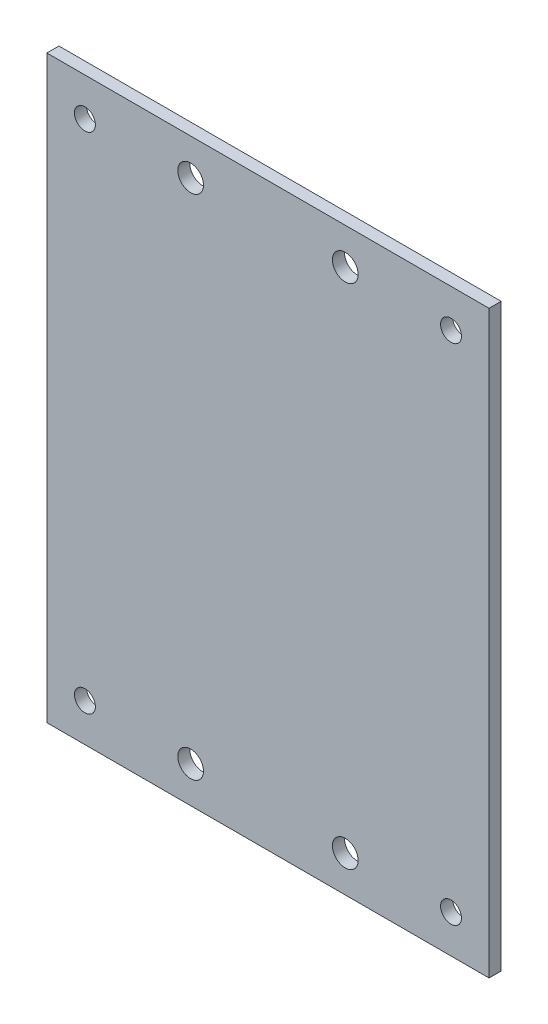
ISO-10303-21;
HEADER;
FILE_DESCRIPTION(('STEP AP214'),'2;1');
FILE_NAME('part.step','',(''),(''),'','','');
FILE_SCHEMA(('AUTOMOTIVE_DESIGN { 1 0 10303 214 1 1 1 1 }'));
ENDSEC;
DATA;
#1=APPLICATION_CONTEXT('core data for automotive mechanical design processes');
#2=APPLICATION_PROTOCOL_DEFINITION('international standard','automotive_design',2000,#1);
#3=PRODUCT_CONTEXT('',#1,'mechanical');
#4=PRODUCT('Part','Part','',(#3));
#5=PRODUCT_RELATED_PRODUCT_CATEGORY('part','',(#4));
#6=PRODUCT_DEFINITION_FORMATION('','',#4);
#7=PRODUCT_DEFINITION_CONTEXT('part definition',#1,'design');
#8=PRODUCT_DEFINITION('design','',#6,#7);
#9=PRODUCT_DEFINITION_SHAPE('','',#8);
#10=(LENGTH_UNIT() NAMED_UNIT(*) SI_UNIT(.MILLI.,.METRE.));
#11=(NAMED_UNIT(*) PLANE_ANGLE_UNIT() SI_UNIT($,.RADIAN.));
#12=(NAMED_UNIT(*) SI_UNIT($,.STERADIAN.) SOLID_ANGLE_UNIT());
#13=UNCERTAINTY_MEASURE_WITH_UNIT(LENGTH_MEASURE(1.E-05),#10,'distance_accuracy_value','');
#14=(GEOMETRIC_REPRESENTATION_CONTEXT(3) GLOBAL_UNCERTAINTY_ASSIGNED_CONTEXT((#13)) GLOBAL_UNIT_ASSIGNED_CONTEXT((#10,
#11,#12)) REPRESENTATION_CONTEXT('',''));
#15=CARTESIAN_POINT('',(0.,0.,0.));
#16=DIRECTION('',(0.,0.,1.));
#17=DIRECTION('',(1.,0.,0.));
#18=AXIS2_PLACEMENT_3D('',#15,#16,#17);
#19=CARTESIAN_POINT('',(0.,0.,3.175));
#20=DIRECTION('',(0.,0.,-1.));
#21=DIRECTION('',(-1.,0.,0.));
#22=AXIS2_PLACEMENT_3D('',#19,#20,#21);
#23=PLANE('',#22);
#24=CARTESIAN_POINT('',(78.42,142.875,3.175));
#25=DIRECTION('',(0.,0.,-1.));
#26=DIRECTION('',(-1.,0.,0.));
#27=AXIS2_PLACEMENT_3D('',#24,#25,#26);
#28=CIRCLE('',#27,3.37819999999999);
#29=CARTESIAN_POINT('',(75.0418,142.875,3.175));
#30=VERTEX_POINT('',#29);
#31=EDGE_CURVE('E158',#30,#30,#28,.T.);
#32=ORIENTED_EDGE('',*,*,#31,.T.);
#33=EDGE_LOOP('',(#32));
#34=FACE_BOUND('',#33,.T.);
#35=CARTESIAN_POINT('',(37.78,142.875,3.175));
#36=DIRECTION('',(0.,0.,-1.));
#37=DIRECTION('',(-1.,0.,0.));
#38=AXIS2_PLACEMENT_3D('',#35,#36,#37);
#39=CIRCLE('',#38,3.37819999999999);
#40=CARTESIAN_POINT('',(34.4018,142.875,3.175));
#41=VERTEX_POINT('',#40);
#42=EDGE_CURVE('E152',#41,#41,#39,.T.);
#43=ORIENTED_EDGE('',*,*,#42,.T.);
#44=EDGE_LOOP('',(#43));
#45=FACE_BOUND('',#44,.T.);
#46=CARTESIAN_POINT('',(37.78,9.525,3.175));
#47=DIRECTION('',(0.,0.,-1.));
#48=DIRECTION('',(-1.,0.,0.));
#49=AXIS2_PLACEMENT_3D('',#46,#47,#48);
#50=CIRCLE('',#49,3.37819999999999);
#51=CARTESIAN_POINT('',(34.4018,9.525,3.175));
#52=VERTEX_POINT('',#51);
#53=EDGE_CURVE('E146',#52,#52,#50,.T.);
#54=ORIENTED_EDGE('',*,*,#53,.T.);
#55=EDGE_LOOP('',(#54));
#56=FACE_BOUND('',#55,.T.);
#57=CARTESIAN_POINT('',(78.42,9.525,3.175));
#58=DIRECTION('',(0.,0.,-1.));
#59=DIRECTION('',(-1.,0.,0.));
#60=AXIS2_PLACEMENT_3D('',#57,#58,#59);
#61=CIRCLE('',#60,3.37819999999999);
#62=CARTESIAN_POINT('',(75.0418,9.525,3.175));
#63=VERTEX_POINT('',#62);
#64=EDGE_CURVE('E140',#63,#63,#61,.T.);
#65=ORIENTED_EDGE('',*,*,#64,.T.);
#66=EDGE_LOOP('',(#65));
#67=FACE_BOUND('',#66,.T.);
#68=CARTESIAN_POINT('',(10.,142.4,3.175));
#69=DIRECTION('',(0.,0.,1.));
#70=DIRECTION('',(1.,0.,0.));
#71=AXIS2_PLACEMENT_3D('',#68,#69,#70);
#72=CIRCLE('',#71,2.75);
#73=CARTESIAN_POINT('',(12.75,142.4,3.175));
#74=VERTEX_POINT('',#73);
#75=EDGE_CURVE('E137',#74,#74,#72,.T.);
#76=ORIENTED_EDGE('',*,*,#75,.F.);
#77=EDGE_LOOP('',(#76));
#78=FACE_BOUND('',#77,.T.);
#79=CARTESIAN_POINT('',(106.2,10.,3.175));
#80=DIRECTION('',(0.,0.,1.));
#81=DIRECTION('',(1.,0.,0.));
#82=AXIS2_PLACEMENT_3D('',#79,#80,#81);
#83=CIRCLE('',#82,2.75);
#84=CARTESIAN_POINT('',(108.95,10.,3.175));
#85=VERTEX_POINT('',#84);
#86=EDGE_CURVE('E125',#85,#85,#83,.T.);
#87=ORIENTED_EDGE('',*,*,#86,.F.);
#88=EDGE_LOOP('',(#87));
#89=FACE_BOUND('',#88,.T.);
#90=CARTESIAN_POINT('',(10.,9.99999999999998,3.175));
#91=DIRECTION('',(0.,0.,1.));
#92=DIRECTION('',(1.,0.,0.));
#93=AXIS2_PLACEMENT_3D('',#90,#91,#92);
#94=CIRCLE('',#93,2.75);
#95=CARTESIAN_POINT('',(12.75,9.99999999999998,3.175));
#96=VERTEX_POINT('',#95);
#97=EDGE_CURVE('E119',#96,#96,#94,.T.);
#98=ORIENTED_EDGE('',*,*,#97,.F.);
#99=EDGE_LOOP('',(#98));
#100=FACE_BOUND('',#99,.T.);
#101=DIRECTION('',(0.,-1.,0.));
#102=VECTOR('',#101,1.);
#103=CARTESIAN_POINT('',(0.,0.,3.175));
#104=LINE('',#103,#102);
#105=CARTESIAN_POINT('',(0.,152.4,3.175));
#106=VERTEX_POINT('',#105);
#107=CARTESIAN_POINT('',(0.,0.,3.175));
#108=VERTEX_POINT('',#107);
#109=EDGE_CURVE('E91',#106,#108,#104,.T.);
#110=ORIENTED_EDGE('',*,*,#109,.T.);
#111=DIRECTION('',(1.,0.,0.));
#112=VECTOR('',#111,1.);
#113=CARTESIAN_POINT('',(0.,0.,3.175));
#114=LINE('',#113,#112);
#115=CARTESIAN_POINT('',(116.2,0.,3.175));
#116=VERTEX_POINT('',#115);
#117=EDGE_CURVE('E86',#108,#116,#114,.T.);
#118=ORIENTED_EDGE('',*,*,#117,.T.);
#119=DIRECTION('',(0.,1.,0.));
#120=VECTOR('',#119,1.);
#121=CARTESIAN_POINT('',(116.2,0.,3.175));
#122=LINE('',#121,#120);
#123=CARTESIAN_POINT('',(116.2,152.4,3.175));
#124=VERTEX_POINT('',#123);
#125=EDGE_CURVE('E89',#116,#124,#122,.T.);
#126=ORIENTED_EDGE('',*,*,#125,.T.);
#127=DIRECTION('',(-1.,0.,0.));
#128=VECTOR('',#127,1.);
#129=CARTESIAN_POINT('',(0.,152.4,3.175));
#130=LINE('',#129,#128);
#131=EDGE_CURVE('E56',#124,#106,#130,.T.);
#132=ORIENTED_EDGE('',*,*,#131,.T.);
#133=EDGE_LOOP('',(#110,#118,#126,#132));
#134=FACE_BOUND('',#133,.T.);
#135=CARTESIAN_POINT('',(106.2,142.4,3.175));
#136=DIRECTION('',(0.,0.,1.));
#137=DIRECTION('',(1.,0.,0.));
#138=AXIS2_PLACEMENT_3D('',#135,#136,#137);
#139=CIRCLE('',#138,2.75);
#140=CARTESIAN_POINT('',(108.95,142.4,3.175));
#141=VERTEX_POINT('',#140);
#142=EDGE_CURVE('E131',#141,#141,#139,.T.);
#143=ORIENTED_EDGE('',*,*,#142,.F.);
#144=EDGE_LOOP('',(#143));
#145=FACE_BOUND('',#144,.T.);
#146=ADVANCED_FACE('F39',(#34,#45,#56,#67,#78,#89,#100,#134,#145),#23,.F.);
#147=CARTESIAN_POINT('',(0.,0.,3.175));
#148=DIRECTION('',(1.,0.,0.));
#149=DIRECTION('',(0.,0.,-1.));
#150=AXIS2_PLACEMENT_3D('',#147,#148,#149);
#151=PLANE('',#150);
#152=DIRECTION('',(0.,-1.,0.));
#153=VECTOR('',#152,1.);
#154=CARTESIAN_POINT('',(0.,0.,0.));
#155=LINE('',#154,#153);
#156=CARTESIAN_POINT('',(0.,152.4,0.));
#157=VERTEX_POINT('',#156);
#158=CARTESIAN_POINT('',(0.,0.,0.));
#159=VERTEX_POINT('',#158);
#160=EDGE_CURVE('E103',#157,#159,#155,.T.);
#161=ORIENTED_EDGE('',*,*,#160,.T.);
#162=DIRECTION('',(0.,0.,-1.));
#163=VECTOR('',#162,1.);
#164=CARTESIAN_POINT('',(0.,0.,3.175));
#165=LINE('',#164,#163);
#166=EDGE_CURVE('E11',#108,#159,#165,.T.);
#167=ORIENTED_EDGE('',*,*,#166,.F.);
#168=ORIENTED_EDGE('',*,*,#109,.F.);
#169=DIRECTION('',(0.,0.,-1.));
#170=VECTOR('',#169,1.);
#171=CARTESIAN_POINT('',(0.,152.4,3.175));
#172=LINE('',#171,#170);
#173=EDGE_CURVE('E99',#106,#157,#172,.T.);
#174=ORIENTED_EDGE('',*,*,#173,.T.);
#175=EDGE_LOOP('',(#161,#167,#168,#174));
#176=FACE_BOUND('',#175,.T.);
#177=ADVANCED_FACE('F41',(#176),#151,.F.);
#178=CARTESIAN_POINT('',(0.,0.,3.175));
#179=DIRECTION('',(0.,1.,0.));
#180=DIRECTION('',(0.,0.,1.));
#181=AXIS2_PLACEMENT_3D('',#178,#179,#180);
#182=PLANE('',#181);
#183=DIRECTION('',(1.,0.,0.));
#184=VECTOR('',#183,1.);
#185=CARTESIAN_POINT('',(0.,0.,0.));
#186=LINE('',#185,#184);
#187=CARTESIAN_POINT('',(116.2,0.,0.));
#188=VERTEX_POINT('',#187);
#189=EDGE_CURVE('E95',#159,#188,#186,.T.);
#190=ORIENTED_EDGE('',*,*,#189,.T.);
#191=DIRECTION('',(0.,0.,-1.));
#192=VECTOR('',#191,1.);
#193=CARTESIAN_POINT('',(116.2,0.,3.175));
#194=LINE('',#193,#192);
#195=EDGE_CURVE('E48',#116,#188,#194,.T.);
#196=ORIENTED_EDGE('',*,*,#195,.F.);
#197=ORIENTED_EDGE('',*,*,#117,.F.);
#198=ORIENTED_EDGE('',*,*,#166,.T.);
#199=EDGE_LOOP('',(#190,#196,#197,#198));
#200=FACE_BOUND('',#199,.T.);
#201=ADVANCED_FACE('F94',(#200),#182,.F.);
#202=CARTESIAN_POINT('',(116.2,0.,3.175));
#203=DIRECTION('',(-1.,0.,0.));
#204=DIRECTION('',(0.,0.,1.));
#205=AXIS2_PLACEMENT_3D('',#202,#203,#204);
#206=PLANE('',#205);
#207=DIRECTION('',(0.,1.,0.));
#208=VECTOR('',#207,1.);
#209=CARTESIAN_POINT('',(116.2,0.,0.));
#210=LINE('',#209,#208);
#211=CARTESIAN_POINT('',(116.2,152.4,0.));
#212=VERTEX_POINT('',#211);
#213=EDGE_CURVE('E73',#188,#212,#210,.T.);
#214=ORIENTED_EDGE('',*,*,#213,.T.);
#215=DIRECTION('',(0.,0.,-1.));
#216=VECTOR('',#215,1.);
#217=CARTESIAN_POINT('',(116.2,152.4,3.175));
#218=LINE('',#217,#216);
#219=EDGE_CURVE('E96',#124,#212,#218,.T.);
#220=ORIENTED_EDGE('',*,*,#219,.F.);
#221=ORIENTED_EDGE('',*,*,#125,.F.);
#222=ORIENTED_EDGE('',*,*,#195,.T.);
#223=EDGE_LOOP('',(#214,#220,#221,#222));
#224=FACE_BOUND('',#223,.T.);
#225=ADVANCED_FACE('F97',(#224),#206,.F.);
#226=CARTESIAN_POINT('',(0.,152.4,3.175));
#227=DIRECTION('',(0.,-1.,0.));
#228=DIRECTION('',(0.,0.,-1.));
#229=AXIS2_PLACEMENT_3D('',#226,#227,#228);
#230=PLANE('',#229);
#231=DIRECTION('',(-1.,0.,0.));
#232=VECTOR('',#231,1.);
#233=CARTESIAN_POINT('',(0.,152.4,0.));
#234=LINE('',#233,#232);
#235=EDGE_CURVE('E79',#212,#157,#234,.T.);
#236=ORIENTED_EDGE('',*,*,#235,.T.);
#237=ORIENTED_EDGE('',*,*,#173,.F.);
#238=ORIENTED_EDGE('',*,*,#131,.F.);
#239=ORIENTED_EDGE('',*,*,#219,.T.);
#240=EDGE_LOOP('',(#236,#237,#238,#239));
#241=FACE_BOUND('',#240,.T.);
#242=ADVANCED_FACE('F111',(#241),#230,.F.);
#243=CARTESIAN_POINT('',(0.,0.,0.));
#244=DIRECTION('',(0.,0.,-1.));
#245=DIRECTION('',(-1.,0.,0.));
#246=AXIS2_PLACEMENT_3D('',#243,#244,#245);
#247=PLANE('',#246);
#248=CARTESIAN_POINT('',(78.42,142.875,0.));
#249=DIRECTION('',(0.,0.,-1.));
#250=DIRECTION('',(-1.,0.,0.));
#251=AXIS2_PLACEMENT_3D('',#248,#249,#250);
#252=CIRCLE('',#251,3.37819999999998);
#253=CARTESIAN_POINT('',(75.0418,142.875,0.));
#254=VERTEX_POINT('',#253);
#255=EDGE_CURVE('E161',#254,#254,#252,.T.);
#256=ORIENTED_EDGE('',*,*,#255,.F.);
#257=EDGE_LOOP('',(#256));
#258=FACE_BOUND('',#257,.T.);
#259=CARTESIAN_POINT('',(37.78,142.875,0.));
#260=DIRECTION('',(0.,0.,-1.));
#261=DIRECTION('',(-1.,0.,0.));
#262=AXIS2_PLACEMENT_3D('',#259,#260,#261);
#263=CIRCLE('',#262,3.37819999999998);
#264=CARTESIAN_POINT('',(34.4018,142.875,0.));
#265=VERTEX_POINT('',#264);
#266=EDGE_CURVE('E155',#265,#265,#263,.T.);
#267=ORIENTED_EDGE('',*,*,#266,.F.);
#268=EDGE_LOOP('',(#267));
#269=FACE_BOUND('',#268,.T.);
#270=CARTESIAN_POINT('',(37.78,9.525,0.));
#271=DIRECTION('',(0.,0.,-1.));
#272=DIRECTION('',(-1.,0.,0.));
#273=AXIS2_PLACEMENT_3D('',#270,#271,#272);
#274=CIRCLE('',#273,3.37819999999998);
#275=CARTESIAN_POINT('',(34.4018,9.525,0.));
#276=VERTEX_POINT('',#275);
#277=EDGE_CURVE('E149',#276,#276,#274,.T.);
#278=ORIENTED_EDGE('',*,*,#277,.F.);
#279=EDGE_LOOP('',(#278));
#280=FACE_BOUND('',#279,.T.);
#281=CARTESIAN_POINT('',(78.42,9.525,0.));
#282=DIRECTION('',(0.,0.,-1.));
#283=DIRECTION('',(-1.,0.,0.));
#284=AXIS2_PLACEMENT_3D('',#281,#282,#283);
#285=CIRCLE('',#284,3.37819999999998);
#286=CARTESIAN_POINT('',(75.0418,9.525,0.));
#287=VERTEX_POINT('',#286);
#288=EDGE_CURVE('E143',#287,#287,#285,.T.);
#289=ORIENTED_EDGE('',*,*,#288,.F.);
#290=EDGE_LOOP('',(#289));
#291=FACE_BOUND('',#290,.T.);
#292=CARTESIAN_POINT('',(10.,142.4,0.));
#293=DIRECTION('',(0.,0.,-1.));
#294=DIRECTION('',(-1.,0.,0.));
#295=AXIS2_PLACEMENT_3D('',#292,#293,#294);
#296=CIRCLE('',#295,2.75);
#297=CARTESIAN_POINT('',(7.25,142.4,0.));
#298=VERTEX_POINT('',#297);
#299=EDGE_CURVE('E134',#298,#298,#296,.T.);
#300=ORIENTED_EDGE('',*,*,#299,.F.);
#301=EDGE_LOOP('',(#300));
#302=FACE_BOUND('',#301,.T.);
#303=CARTESIAN_POINT('',(106.2,142.4,0.));
#304=DIRECTION('',(0.,0.,-1.));
#305=DIRECTION('',(-1.,0.,0.));
#306=AXIS2_PLACEMENT_3D('',#303,#304,#305);
#307=CIRCLE('',#306,2.75);
#308=CARTESIAN_POINT('',(103.45,142.4,0.));
#309=VERTEX_POINT('',#308);
#310=EDGE_CURVE('E128',#309,#309,#307,.T.);
#311=ORIENTED_EDGE('',*,*,#310,.F.);
#312=EDGE_LOOP('',(#311));
#313=FACE_BOUND('',#312,.T.);
#314=CARTESIAN_POINT('',(106.2,10.,0.));
#315=DIRECTION('',(0.,0.,-1.));
#316=DIRECTION('',(-1.,0.,0.));
#317=AXIS2_PLACEMENT_3D('',#314,#315,#316);
#318=CIRCLE('',#317,2.75);
#319=CARTESIAN_POINT('',(103.45,10.,0.));
#320=VERTEX_POINT('',#319);
#321=EDGE_CURVE('E122',#320,#320,#318,.T.);
#322=ORIENTED_EDGE('',*,*,#321,.F.);
#323=EDGE_LOOP('',(#322));
#324=FACE_BOUND('',#323,.T.);
#325=CARTESIAN_POINT('',(10.,9.99999999999998,0.));
#326=DIRECTION('',(0.,0.,-1.));
#327=DIRECTION('',(-1.,0.,0.));
#328=AXIS2_PLACEMENT_3D('',#325,#326,#327);
#329=CIRCLE('',#328,2.75);
#330=CARTESIAN_POINT('',(7.25000000000002,9.99999999999998,0.));
#331=VERTEX_POINT('',#330);
#332=EDGE_CURVE('E106',#331,#331,#329,.T.);
#333=ORIENTED_EDGE('',*,*,#332,.F.);
#334=EDGE_LOOP('',(#333));
#335=FACE_BOUND('',#334,.T.);
#336=ORIENTED_EDGE('',*,*,#160,.F.);
#337=ORIENTED_EDGE('',*,*,#235,.F.);
#338=ORIENTED_EDGE('',*,*,#213,.F.);
#339=ORIENTED_EDGE('',*,*,#189,.F.);
#340=EDGE_LOOP('',(#336,#337,#338,#339));
#341=FACE_BOUND('',#340,.T.);
#342=ADVANCED_FACE('F114',(#258,#269,#280,#291,#302,#313,#324,#335,#341),#247,.T.);
#343=CARTESIAN_POINT('',(10.,9.99999999999998,3.175));
#344=DIRECTION('',(0.,0.,1.));
#345=DIRECTION('',(1.,0.,0.));
#346=AXIS2_PLACEMENT_3D('',#343,#344,#345);
#347=CYLINDRICAL_SURFACE('',#346,2.75);
#348=ORIENTED_EDGE('',*,*,#97,.T.);
#349=EDGE_LOOP('',(#348));
#350=FACE_BOUND('',#349,.T.);
#351=ORIENTED_EDGE('',*,*,#332,.T.);
#352=EDGE_LOOP('',(#351));
#353=FACE_BOUND('',#352,.T.);
#354=ADVANCED_FACE('F169',(#350,#353),#347,.F.);
#355=CARTESIAN_POINT('',(106.2,10.,3.175));
#356=DIRECTION('',(0.,0.,1.));
#357=DIRECTION('',(1.,0.,0.));
#358=AXIS2_PLACEMENT_3D('',#355,#356,#357);
#359=CYLINDRICAL_SURFACE('',#358,2.75);
#360=ORIENTED_EDGE('',*,*,#86,.T.);
#361=EDGE_LOOP('',(#360));
#362=FACE_BOUND('',#361,.T.);
#363=ORIENTED_EDGE('',*,*,#321,.T.);
#364=EDGE_LOOP('',(#363));
#365=FACE_BOUND('',#364,.T.);
#366=ADVANCED_FACE('F186',(#362,#365),#359,.F.);
#367=CARTESIAN_POINT('',(106.2,142.4,3.175));
#368=DIRECTION('',(0.,0.,1.));
#369=DIRECTION('',(1.,0.,0.));
#370=AXIS2_PLACEMENT_3D('',#367,#368,#369);
#371=CYLINDRICAL_SURFACE('',#370,2.75);
#372=ORIENTED_EDGE('',*,*,#142,.T.);
#373=EDGE_LOOP('',(#372));
#374=FACE_BOUND('',#373,.T.);
#375=ORIENTED_EDGE('',*,*,#310,.T.);
#376=EDGE_LOOP('',(#375));
#377=FACE_BOUND('',#376,.T.);
#378=ADVANCED_FACE('F192',(#374,#377),#371,.F.);
#379=CARTESIAN_POINT('',(10.,142.4,3.175));
#380=DIRECTION('',(0.,0.,1.));
#381=DIRECTION('',(1.,0.,0.));
#382=AXIS2_PLACEMENT_3D('',#379,#380,#381);
#383=CYLINDRICAL_SURFACE('',#382,2.75);
#384=ORIENTED_EDGE('',*,*,#75,.T.);
#385=EDGE_LOOP('',(#384));
#386=FACE_BOUND('',#385,.T.);
#387=ORIENTED_EDGE('',*,*,#299,.T.);
#388=EDGE_LOOP('',(#387));
#389=FACE_BOUND('',#388,.T.);
#390=ADVANCED_FACE('F239',(#386,#389),#383,.F.);
#391=CARTESIAN_POINT('',(78.42,9.525,0.));
#392=DIRECTION('',(0.,0.,-1.));
#393=DIRECTION('',(-1.,0.,0.));
#394=AXIS2_PLACEMENT_3D('',#391,#392,#393);
#395=CYLINDRICAL_SURFACE('',#394,3.37819999999999);
#396=ORIENTED_EDGE('',*,*,#64,.F.);
#397=EDGE_LOOP('',(#396));
#398=FACE_BOUND('',#397,.T.);
#399=ORIENTED_EDGE('',*,*,#288,.T.);
#400=EDGE_LOOP('',(#399));
#401=FACE_BOUND('',#400,.T.);
#402=ADVANCED_FACE('F233',(#398,#401),#395,.F.);
#403=CARTESIAN_POINT('',(37.78,9.525,0.));
#404=DIRECTION('',(0.,0.,-1.));
#405=DIRECTION('',(-1.,0.,0.));
#406=AXIS2_PLACEMENT_3D('',#403,#404,#405);
#407=CYLINDRICAL_SURFACE('',#406,3.37819999999999);
#408=ORIENTED_EDGE('',*,*,#53,.F.);
#409=EDGE_LOOP('',(#408));
#410=FACE_BOUND('',#409,.T.);
#411=ORIENTED_EDGE('',*,*,#277,.T.);
#412=EDGE_LOOP('',(#411));
#413=FACE_BOUND('',#412,.T.);
#414=ADVANCED_FACE('F238',(#410,#413),#407,.F.);
#415=CARTESIAN_POINT('',(37.78,142.875,0.));
#416=DIRECTION('',(0.,0.,-1.));
#417=DIRECTION('',(-1.,0.,0.));
#418=AXIS2_PLACEMENT_3D('',#415,#416,#417);
#419=CYLINDRICAL_SURFACE('',#418,3.37819999999999);
#420=ORIENTED_EDGE('',*,*,#42,.F.);
#421=EDGE_LOOP('',(#420));
#422=FACE_BOUND('',#421,.T.);
#423=ORIENTED_EDGE('',*,*,#266,.T.);
#424=EDGE_LOOP('',(#423));
#425=FACE_BOUND('',#424,.T.);
#426=ADVANCED_FACE('F252',(#422,#425),#419,.F.);
#427=CARTESIAN_POINT('',(78.42,142.875,0.));
#428=DIRECTION('',(0.,0.,-1.));
#429=DIRECTION('',(-1.,0.,0.));
#430=AXIS2_PLACEMENT_3D('',#427,#428,#429);
#431=CYLINDRICAL_SURFACE('',#430,3.37819999999999);
#432=ORIENTED_EDGE('',*,*,#31,.F.);
#433=EDGE_LOOP('',(#432));
#434=FACE_BOUND('',#433,.T.);
#435=ORIENTED_EDGE('',*,*,#255,.T.);
#436=EDGE_LOOP('',(#435));
#437=FACE_BOUND('',#436,.T.);
#438=ADVANCED_FACE('F165',(#434,#437),#431,.F.);
#439=CLOSED_SHELL('',(#146,#177,#201,#225,#242,#342,#354,#366,#378,#390,#402,#414,#426,#438));
#440=MANIFOLD_SOLID_BREP('B2',#439);
#441=ADVANCED_BREP_SHAPE_REPRESENTATION('',(#18,#440),#14);
#442=SHAPE_DEFINITION_REPRESENTATION(#9,#441);
ENDSEC;
END-ISO-10303-21;
